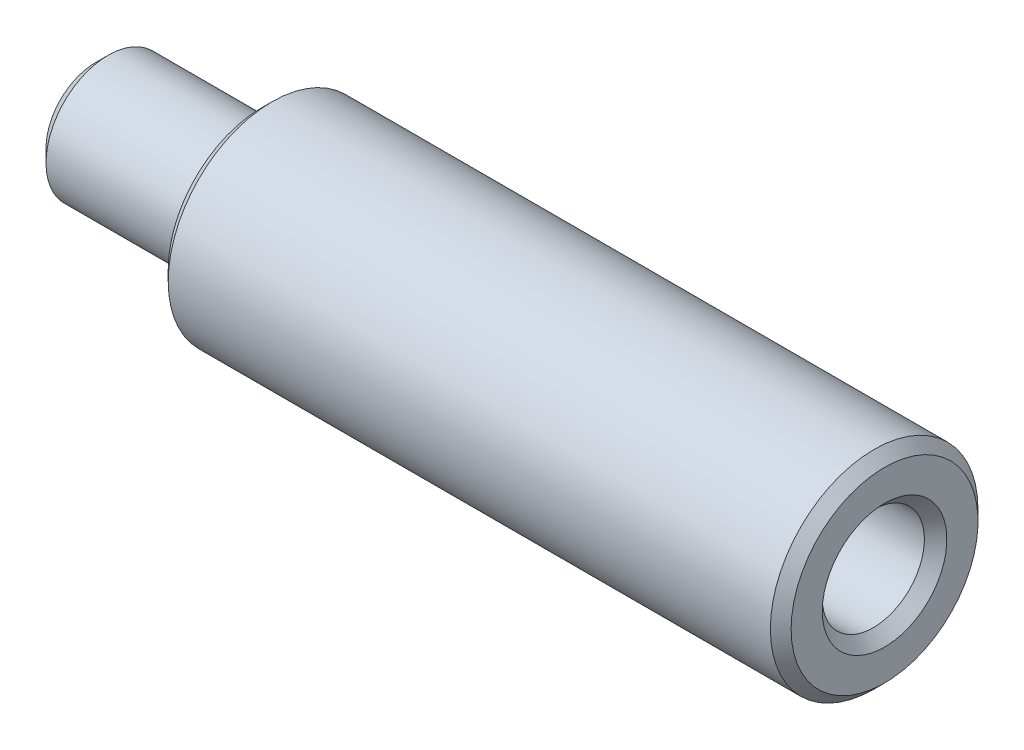
ISO-10303-21;
HEADER;
FILE_DESCRIPTION(('STEP AP214'),'2;1');
FILE_NAME('part.step','',(''),(''),'','','');
FILE_SCHEMA(('AUTOMOTIVE_DESIGN { 1 0 10303 214 1 1 1 1 }'));
ENDSEC;
DATA;
#1=APPLICATION_CONTEXT('core data for automotive mechanical design processes');
#2=APPLICATION_PROTOCOL_DEFINITION('international standard','automotive_design',2000,#1);
#3=PRODUCT_CONTEXT('',#1,'mechanical');
#4=PRODUCT('Part','Part','',(#3));
#5=PRODUCT_RELATED_PRODUCT_CATEGORY('part','',(#4));
#6=PRODUCT_DEFINITION_FORMATION('','',#4);
#7=PRODUCT_DEFINITION_CONTEXT('part definition',#1,'design');
#8=PRODUCT_DEFINITION('design','',#6,#7);
#9=PRODUCT_DEFINITION_SHAPE('','',#8);
#10=(LENGTH_UNIT() NAMED_UNIT(*) SI_UNIT(.MILLI.,.METRE.));
#11=(NAMED_UNIT(*) PLANE_ANGLE_UNIT() SI_UNIT($,.RADIAN.));
#12=(NAMED_UNIT(*) SI_UNIT($,.STERADIAN.) SOLID_ANGLE_UNIT());
#13=UNCERTAINTY_MEASURE_WITH_UNIT(LENGTH_MEASURE(1.E-05),#10,'distance_accuracy_value','');
#14=(GEOMETRIC_REPRESENTATION_CONTEXT(3) GLOBAL_UNCERTAINTY_ASSIGNED_CONTEXT((#13)) GLOBAL_UNIT_ASSIGNED_CONTEXT((#10,
#11,#12)) REPRESENTATION_CONTEXT('',''));
#15=CARTESIAN_POINT('',(0.,0.,0.));
#16=DIRECTION('',(0.,0.,1.));
#17=DIRECTION('',(1.,0.,0.));
#18=AXIS2_PLACEMENT_3D('',#15,#16,#17);
#19=CARTESIAN_POINT('',(0.,0.,0.));
#20=DIRECTION('',(1.,0.,0.));
#21=DIRECTION('',(0.,0.,-1.));
#22=AXIS2_PLACEMENT_3D('',#19,#20,#21);
#23=PLANE('',#22);
#24=CARTESIAN_POINT('',(0.,0.,0.));
#25=DIRECTION('',(-1.,0.,0.));
#26=DIRECTION('',(0.,0.,1.));
#27=AXIS2_PLACEMENT_3D('',#24,#25,#26);
#28=CIRCLE('',#27,3.49999999999996);
#29=CARTESIAN_POINT('',(0.,0.,3.49999999999996));
#30=VERTEX_POINT('',#29);
#31=EDGE_CURVE('E11',#30,#30,#28,.T.);
#32=ORIENTED_EDGE('',*,*,#31,.F.);
#33=EDGE_LOOP('',(#32));
#34=FACE_BOUND('',#33,.T.);
#35=CARTESIAN_POINT('',(0.,0.,0.));
#36=DIRECTION('',(-1.,0.,0.));
#37=DIRECTION('',(0.,0.,1.));
#38=AXIS2_PLACEMENT_3D('',#35,#36,#37);
#39=CIRCLE('',#38,4.5);
#40=CARTESIAN_POINT('',(0.,0.,4.5));
#41=VERTEX_POINT('',#40);
#42=EDGE_CURVE('E48',#41,#41,#39,.T.);
#43=ORIENTED_EDGE('',*,*,#42,.T.);
#44=EDGE_LOOP('',(#43));
#45=FACE_BOUND('',#44,.T.);
#46=ADVANCED_FACE('F42',(#34,#45),#23,.F.);
#47=CARTESIAN_POINT('',(0.5,0.,0.));
#48=DIRECTION('',(1.,0.,0.));
#49=DIRECTION('',(0.,0.,-1.));
#50=AXIS2_PLACEMENT_3D('',#47,#48,#49);
#51=CONICAL_SURFACE('',#50,5.,0.785398163397448);
#52=ORIENTED_EDGE('',*,*,#42,.F.);
#53=EDGE_LOOP('',(#52));
#54=FACE_BOUND('',#53,.T.);
#55=CARTESIAN_POINT('',(0.5,0.,0.));
#56=DIRECTION('',(-1.,0.,0.));
#57=DIRECTION('',(0.,0.,1.));
#58=AXIS2_PLACEMENT_3D('',#55,#56,#57);
#59=CIRCLE('',#58,5.);
#60=CARTESIAN_POINT('',(0.5,0.,5.));
#61=VERTEX_POINT('',#60);
#62=EDGE_CURVE('E83',#61,#61,#59,.T.);
#63=ORIENTED_EDGE('',*,*,#62,.T.);
#64=EDGE_LOOP('',(#63));
#65=FACE_BOUND('',#64,.T.);
#66=ADVANCED_FACE('F89',(#54,#65),#51,.T.);
#67=CARTESIAN_POINT('',(30.,0.,0.));
#68=DIRECTION('',(-1.,0.,0.));
#69=DIRECTION('',(0.,0.,1.));
#70=AXIS2_PLACEMENT_3D('',#67,#68,#69);
#71=CYLINDRICAL_SURFACE('',#70,5.);
#72=ORIENTED_EDGE('',*,*,#62,.F.);
#73=EDGE_LOOP('',(#72));
#74=FACE_BOUND('',#73,.T.);
#75=CARTESIAN_POINT('',(29.5,0.,0.));
#76=DIRECTION('',(-1.,0.,0.));
#77=DIRECTION('',(0.,0.,1.));
#78=AXIS2_PLACEMENT_3D('',#75,#76,#77);
#79=CIRCLE('',#78,5.);
#80=CARTESIAN_POINT('',(29.5,0.,5.));
#81=VERTEX_POINT('',#80);
#82=EDGE_CURVE('E80',#81,#81,#79,.T.);
#83=ORIENTED_EDGE('',*,*,#82,.T.);
#84=EDGE_LOOP('',(#83));
#85=FACE_BOUND('',#84,.T.);
#86=ADVANCED_FACE('F92',(#74,#85),#71,.T.);
#87=CARTESIAN_POINT('',(30.,0.,0.));
#88=DIRECTION('',(-1.,0.,0.));
#89=DIRECTION('',(0.,0.,1.));
#90=AXIS2_PLACEMENT_3D('',#87,#88,#89);
#91=CONICAL_SURFACE('',#90,4.5,0.785398163397448);
#92=ORIENTED_EDGE('',*,*,#82,.F.);
#93=EDGE_LOOP('',(#92));
#94=FACE_BOUND('',#93,.T.);
#95=CARTESIAN_POINT('',(30.,0.,0.));
#96=DIRECTION('',(-1.,0.,0.));
#97=DIRECTION('',(0.,0.,1.));
#98=AXIS2_PLACEMENT_3D('',#95,#96,#97);
#99=CIRCLE('',#98,4.5);
#100=CARTESIAN_POINT('',(30.,0.,4.5));
#101=VERTEX_POINT('',#100);
#102=EDGE_CURVE('E77',#101,#101,#99,.T.);
#103=ORIENTED_EDGE('',*,*,#102,.T.);
#104=EDGE_LOOP('',(#103));
#105=FACE_BOUND('',#104,.T.);
#106=ADVANCED_FACE('F97',(#94,#105),#91,.T.);
#107=CARTESIAN_POINT('',(30.,4.5,0.));
#108=DIRECTION('',(-1.,0.,0.));
#109=DIRECTION('',(0.,0.,1.));
#110=AXIS2_PLACEMENT_3D('',#107,#108,#109);
#111=PLANE('',#110);
#112=CARTESIAN_POINT('',(30.,0.,0.));
#113=DIRECTION('',(-1.,0.,0.));
#114=DIRECTION('',(0.,0.,1.));
#115=AXIS2_PLACEMENT_3D('',#112,#113,#114);
#116=CIRCLE('',#115,3.);
#117=CARTESIAN_POINT('',(30.,0.,3.));
#118=VERTEX_POINT('',#117);
#119=EDGE_CURVE('E63',#118,#118,#116,.T.);
#120=ORIENTED_EDGE('',*,*,#119,.T.);
#121=EDGE_LOOP('',(#120));
#122=FACE_BOUND('',#121,.T.);
#123=ORIENTED_EDGE('',*,*,#102,.F.);
#124=EDGE_LOOP('',(#123));
#125=FACE_BOUND('',#124,.T.);
#126=ADVANCED_FACE('F103',(#122,#125),#111,.F.);
#127=CARTESIAN_POINT('',(-0.499999999999961,0.,0.));
#128=DIRECTION('',(-1.,0.,0.));
#129=DIRECTION('',(0.,0.,1.));
#130=AXIS2_PLACEMENT_3D('',#127,#128,#129);
#131=TOROIDAL_SURFACE('',#130,3.49999999999996,0.499999999999962);
#132=CARTESIAN_POINT('',(-0.5,0.,0.));
#133=DIRECTION('',(-1.,0.,0.));
#134=DIRECTION('',(0.,0.,1.));
#135=AXIS2_PLACEMENT_3D('',#132,#133,#134);
#136=CIRCLE('',#135,3.);
#137=CARTESIAN_POINT('',(-0.5,0.,3.));
#138=VERTEX_POINT('',#137);
#139=EDGE_CURVE('E74',#138,#138,#136,.T.);
#140=ORIENTED_EDGE('',*,*,#139,.F.);
#141=EDGE_LOOP('',(#140));
#142=FACE_BOUND('',#141,.T.);
#143=ORIENTED_EDGE('',*,*,#31,.T.);
#144=EDGE_LOOP('',(#143));
#145=FACE_BOUND('',#144,.T.);
#146=ADVANCED_FACE('F108',(#142,#145),#131,.F.);
#147=CARTESIAN_POINT('',(0.,0.,0.));
#148=DIRECTION('',(-1.,0.,0.));
#149=DIRECTION('',(0.,0.,1.));
#150=AXIS2_PLACEMENT_3D('',#147,#148,#149);
#151=CYLINDRICAL_SURFACE('',#150,3.);
#152=CARTESIAN_POINT('',(-7.3865,0.,0.));
#153=DIRECTION('',(-1.,0.,0.));
#154=DIRECTION('',(0.,0.,1.));
#155=AXIS2_PLACEMENT_3D('',#152,#153,#154);
#156=CIRCLE('',#155,3.);
#157=CARTESIAN_POINT('',(-7.3865,0.,3.));
#158=VERTEX_POINT('',#157);
#159=EDGE_CURVE('E71',#158,#158,#156,.T.);
#160=ORIENTED_EDGE('',*,*,#159,.F.);
#161=EDGE_LOOP('',(#160));
#162=FACE_BOUND('',#161,.T.);
#163=ORIENTED_EDGE('',*,*,#139,.T.);
#164=EDGE_LOOP('',(#163));
#165=FACE_BOUND('',#164,.T.);
#166=ADVANCED_FACE('F114',(#162,#165),#151,.T.);
#167=CARTESIAN_POINT('',(-7.3865,0.,0.));
#168=DIRECTION('',(1.,0.,0.));
#169=DIRECTION('',(0.,0.,-1.));
#170=AXIS2_PLACEMENT_3D('',#167,#168,#169);
#171=CONICAL_SURFACE('',#170,3.,0.785398163397448);
#172=CARTESIAN_POINT('',(-8.,0.,0.));
#173=DIRECTION('',(-1.,0.,0.));
#174=DIRECTION('',(0.,0.,1.));
#175=AXIS2_PLACEMENT_3D('',#172,#173,#174);
#176=CIRCLE('',#175,2.3865);
#177=CARTESIAN_POINT('',(-8.,0.,2.3865));
#178=VERTEX_POINT('',#177);
#179=EDGE_CURVE('E68',#178,#178,#176,.T.);
#180=ORIENTED_EDGE('',*,*,#179,.F.);
#181=EDGE_LOOP('',(#180));
#182=FACE_BOUND('',#181,.T.);
#183=ORIENTED_EDGE('',*,*,#159,.T.);
#184=EDGE_LOOP('',(#183));
#185=FACE_BOUND('',#184,.T.);
#186=ADVANCED_FACE('F158',(#182,#185),#171,.T.);
#187=CARTESIAN_POINT('',(-8.,0.,0.));
#188=DIRECTION('',(1.,0.,0.));
#189=DIRECTION('',(0.,0.,-1.));
#190=AXIS2_PLACEMENT_3D('',#187,#188,#189);
#191=PLANE('',#190);
#192=ORIENTED_EDGE('',*,*,#179,.T.);
#193=EDGE_LOOP('',(#192));
#194=FACE_BOUND('',#193,.T.);
#195=ADVANCED_FACE('F168',(#194),#191,.F.);
#196=CARTESIAN_POINT('',(30.,0.,0.));
#197=DIRECTION('',(1.,0.,0.));
#198=DIRECTION('',(0.,0.,-1.));
#199=AXIS2_PLACEMENT_3D('',#196,#197,#198);
#200=CONICAL_SURFACE('',#199,3.,0.785398163397448);
#201=CARTESIAN_POINT('',(29.4585,0.,0.));
#202=DIRECTION('',(-1.,0.,0.));
#203=DIRECTION('',(0.,0.,1.));
#204=AXIS2_PLACEMENT_3D('',#201,#202,#203);
#205=CIRCLE('',#204,2.4585);
#206=CARTESIAN_POINT('',(29.4585,0.,2.4585));
#207=VERTEX_POINT('',#206);
#208=EDGE_CURVE('E60',#207,#207,#205,.T.);
#209=ORIENTED_EDGE('',*,*,#208,.T.);
#210=EDGE_LOOP('',(#209));
#211=FACE_BOUND('',#210,.T.);
#212=ORIENTED_EDGE('',*,*,#119,.F.);
#213=EDGE_LOOP('',(#212));
#214=FACE_BOUND('',#213,.T.);
#215=ADVANCED_FACE('F177',(#211,#214),#200,.F.);
#216=CARTESIAN_POINT('',(30.,0.,0.));
#217=DIRECTION('',(-1.,0.,0.));
#218=DIRECTION('',(0.,0.,1.));
#219=AXIS2_PLACEMENT_3D('',#216,#217,#218);
#220=CYLINDRICAL_SURFACE('',#219,2.4585);
#221=CARTESIAN_POINT('',(6.4194156368027,0.,0.));
#222=DIRECTION('',(-1.,0.,0.));
#223=DIRECTION('',(0.,0.,1.));
#224=AXIS2_PLACEMENT_3D('',#221,#222,#223);
#225=CIRCLE('',#224,2.4585);
#226=CARTESIAN_POINT('',(6.4194156368027,0.,2.4585));
#227=VERTEX_POINT('',#226);
#228=EDGE_CURVE('E58',#227,#227,#225,.T.);
#229=ORIENTED_EDGE('',*,*,#228,.T.);
#230=EDGE_LOOP('',(#229));
#231=FACE_BOUND('',#230,.T.);
#232=ORIENTED_EDGE('',*,*,#208,.F.);
#233=EDGE_LOOP('',(#232));
#234=FACE_BOUND('',#233,.T.);
#235=ADVANCED_FACE('F54',(#231,#234),#220,.F.);
#236=CARTESIAN_POINT('',(6.4194156368027,0.,0.));
#237=DIRECTION('',(1.,0.,0.));
#238=DIRECTION('',(0.,0.,-1.));
#239=AXIS2_PLACEMENT_3D('',#236,#237,#238);
#240=CONICAL_SURFACE('',#239,2.4585,1.0471975511966);
#241=CARTESIAN_POINT('',(5.,0.,0.));
#242=VERTEX_POINT('',#241);
#243=VERTEX_LOOP('',#242);
#244=FACE_BOUND('',#243,.T.);
#245=ORIENTED_EDGE('',*,*,#228,.F.);
#246=EDGE_LOOP('',(#245));
#247=FACE_BOUND('',#246,.T.);
#248=ADVANCED_FACE('F51',(#244,#247),#240,.F.);
#249=CLOSED_SHELL('',(#46,#66,#86,#106,#126,#146,#166,#186,#195,#215,#235,#248));
#250=MANIFOLD_SOLID_BREP('B2',#249);
#251=ADVANCED_BREP_SHAPE_REPRESENTATION('',(#18,#250),#14);
#252=SHAPE_DEFINITION_REPRESENTATION(#9,#251);
ENDSEC;
END-ISO-10303-21;
